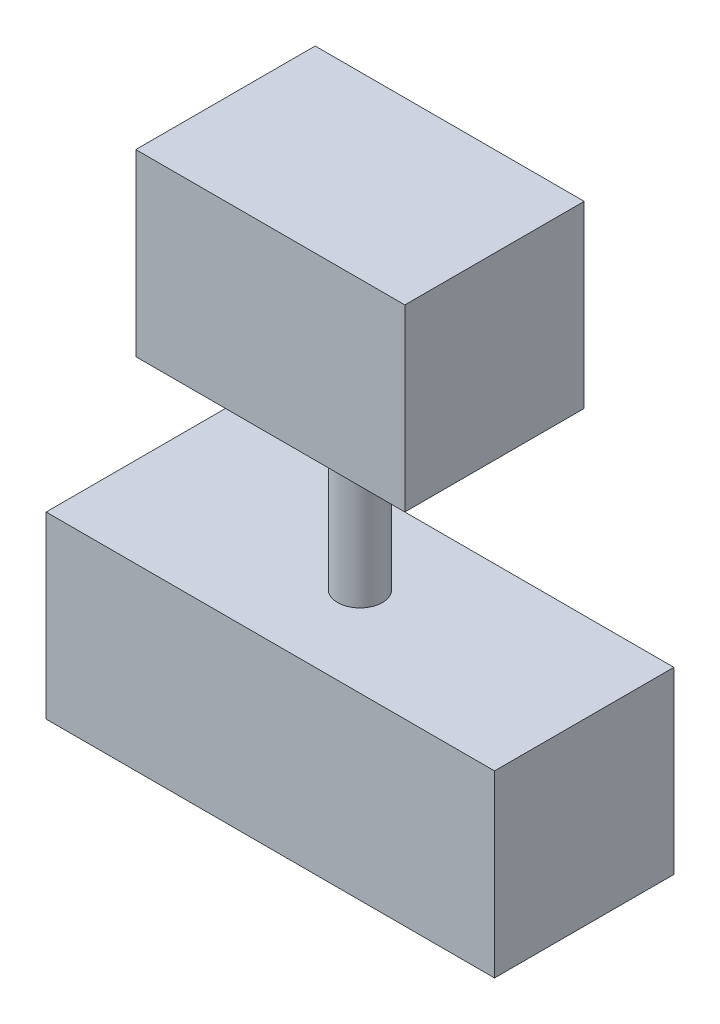
ISO-10303-21;
HEADER;
FILE_DESCRIPTION(('STEP AP214'),'2;1');
FILE_NAME('part.step','',(''),(''),'','','');
FILE_SCHEMA(('AUTOMOTIVE_DESIGN { 1 0 10303 214 1 1 1 1 }'));
ENDSEC;
DATA;
#1=APPLICATION_CONTEXT('core data for automotive mechanical design processes');
#2=APPLICATION_PROTOCOL_DEFINITION('international standard','automotive_design',2000,#1);
#3=PRODUCT_CONTEXT('',#1,'mechanical');
#4=PRODUCT('Part','Part','',(#3));
#5=PRODUCT_RELATED_PRODUCT_CATEGORY('part','',(#4));
#6=PRODUCT_DEFINITION_FORMATION('','',#4);
#7=PRODUCT_DEFINITION_CONTEXT('part definition',#1,'design');
#8=PRODUCT_DEFINITION('design','',#6,#7);
#9=PRODUCT_DEFINITION_SHAPE('','',#8);
#10=(LENGTH_UNIT() NAMED_UNIT(*) SI_UNIT(.MILLI.,.METRE.));
#11=(NAMED_UNIT(*) PLANE_ANGLE_UNIT() SI_UNIT($,.RADIAN.));
#12=(NAMED_UNIT(*) SI_UNIT($,.STERADIAN.) SOLID_ANGLE_UNIT());
#13=UNCERTAINTY_MEASURE_WITH_UNIT(LENGTH_MEASURE(1.E-05),#10,'distance_accuracy_value','');
#14=(GEOMETRIC_REPRESENTATION_CONTEXT(3) GLOBAL_UNCERTAINTY_ASSIGNED_CONTEXT((#13)) GLOBAL_UNIT_ASSIGNED_CONTEXT((#10,
#11,#12)) REPRESENTATION_CONTEXT('',''));
#15=CARTESIAN_POINT('',(0.,0.,0.));
#16=DIRECTION('',(0.,0.,1.));
#17=DIRECTION('',(1.,0.,0.));
#18=AXIS2_PLACEMENT_3D('',#15,#16,#17);
#19=CARTESIAN_POINT('',(15.,50.,20.));
#20=DIRECTION('',(-1.,0.,0.));
#21=DIRECTION('',(0.,-1.,0.));
#22=AXIS2_PLACEMENT_3D('',#19,#20,#21);
#23=PLANE('',#22);
#24=DIRECTION('',(0.,1.,0.));
#25=VECTOR('',#24,1.);
#26=CARTESIAN_POINT('',(15.,50.,0.));
#27=LINE('',#26,#25);
#28=CARTESIAN_POINT('',(15.,30.,0.));
#29=VERTEX_POINT('',#28);
#30=CARTESIAN_POINT('',(15.,50.,0.));
#31=VERTEX_POINT('',#30);
#32=EDGE_CURVE('E111',#29,#31,#27,.T.);
#33=ORIENTED_EDGE('',*,*,#32,.T.);
#34=DIRECTION('',(0.,0.,-1.));
#35=VECTOR('',#34,1.);
#36=CARTESIAN_POINT('',(15.,50.,20.));
#37=LINE('',#36,#35);
#38=CARTESIAN_POINT('',(15.,50.,20.));
#39=VERTEX_POINT('',#38);
#40=EDGE_CURVE('E12',#39,#31,#37,.T.);
#41=ORIENTED_EDGE('',*,*,#40,.F.);
#42=DIRECTION('',(0.,1.,0.));
#43=VECTOR('',#42,1.);
#44=CARTESIAN_POINT('',(15.,50.,20.));
#45=LINE('',#44,#43);
#46=CARTESIAN_POINT('',(15.,30.,20.));
#47=VERTEX_POINT('',#46);
#48=EDGE_CURVE('E99',#47,#39,#45,.T.);
#49=ORIENTED_EDGE('',*,*,#48,.F.);
#50=DIRECTION('',(0.,0.,-1.));
#51=VECTOR('',#50,1.);
#52=CARTESIAN_POINT('',(15.,30.,20.));
#53=LINE('',#52,#51);
#54=EDGE_CURVE('E107',#47,#29,#53,.T.);
#55=ORIENTED_EDGE('',*,*,#54,.T.);
#56=EDGE_LOOP('',(#33,#41,#49,#55));
#57=FACE_BOUND('',#56,.T.);
#58=ADVANCED_FACE('F48',(#57),#23,.F.);
#59=CARTESIAN_POINT('',(15.,50.,20.));
#60=DIRECTION('',(0.,-1.,0.));
#61=DIRECTION('',(0.,0.,-1.));
#62=AXIS2_PLACEMENT_3D('',#59,#60,#61);
#63=PLANE('',#62);
#64=DIRECTION('',(-1.,0.,0.));
#65=VECTOR('',#64,1.);
#66=CARTESIAN_POINT('',(15.,50.,0.));
#67=LINE('',#66,#65);
#68=CARTESIAN_POINT('',(-15.,50.,0.));
#69=VERTEX_POINT('',#68);
#70=EDGE_CURVE('E103',#31,#69,#67,.T.);
#71=ORIENTED_EDGE('',*,*,#70,.T.);
#72=DIRECTION('',(0.,0.,-1.));
#73=VECTOR('',#72,1.);
#74=CARTESIAN_POINT('',(-15.,50.,20.));
#75=LINE('',#74,#73);
#76=CARTESIAN_POINT('',(-15.,50.,20.));
#77=VERTEX_POINT('',#76);
#78=EDGE_CURVE('E56',#77,#69,#75,.T.);
#79=ORIENTED_EDGE('',*,*,#78,.F.);
#80=DIRECTION('',(-1.,0.,0.));
#81=VECTOR('',#80,1.);
#82=CARTESIAN_POINT('',(15.,50.,20.));
#83=LINE('',#82,#81);
#84=EDGE_CURVE('E94',#39,#77,#83,.T.);
#85=ORIENTED_EDGE('',*,*,#84,.F.);
#86=ORIENTED_EDGE('',*,*,#40,.T.);
#87=EDGE_LOOP('',(#71,#79,#85,#86));
#88=FACE_BOUND('',#87,.T.);
#89=ADVANCED_FACE('F102',(#88),#63,.F.);
#90=CARTESIAN_POINT('',(-15.,50.,20.));
#91=DIRECTION('',(1.,0.,0.));
#92=DIRECTION('',(0.,1.,0.));
#93=AXIS2_PLACEMENT_3D('',#90,#91,#92);
#94=PLANE('',#93);
#95=DIRECTION('',(0.,-1.,0.));
#96=VECTOR('',#95,1.);
#97=CARTESIAN_POINT('',(-15.,50.,0.));
#98=LINE('',#97,#96);
#99=CARTESIAN_POINT('',(-15.,30.,0.));
#100=VERTEX_POINT('',#99);
#101=EDGE_CURVE('E81',#69,#100,#98,.T.);
#102=ORIENTED_EDGE('',*,*,#101,.T.);
#103=DIRECTION('',(0.,0.,-1.));
#104=VECTOR('',#103,1.);
#105=CARTESIAN_POINT('',(-15.,30.,20.));
#106=LINE('',#105,#104);
#107=CARTESIAN_POINT('',(-15.,30.,20.));
#108=VERTEX_POINT('',#107);
#109=EDGE_CURVE('E104',#108,#100,#106,.T.);
#110=ORIENTED_EDGE('',*,*,#109,.F.);
#111=DIRECTION('',(0.,-1.,0.));
#112=VECTOR('',#111,1.);
#113=CARTESIAN_POINT('',(-15.,50.,20.));
#114=LINE('',#113,#112);
#115=EDGE_CURVE('E97',#77,#108,#114,.T.);
#116=ORIENTED_EDGE('',*,*,#115,.F.);
#117=ORIENTED_EDGE('',*,*,#78,.T.);
#118=EDGE_LOOP('',(#102,#110,#116,#117));
#119=FACE_BOUND('',#118,.T.);
#120=ADVANCED_FACE('F105',(#119),#94,.F.);
#121=CARTESIAN_POINT('',(15.,30.,20.));
#122=DIRECTION('',(0.,1.,0.));
#123=DIRECTION('',(0.,0.,1.));
#124=AXIS2_PLACEMENT_3D('',#121,#122,#123);
#125=PLANE('',#124);
#126=DIRECTION('',(1.,0.,0.));
#127=VECTOR('',#126,1.);
#128=CARTESIAN_POINT('',(15.,30.,0.));
#129=LINE('',#128,#127);
#130=EDGE_CURVE('E87',#100,#29,#129,.T.);
#131=ORIENTED_EDGE('',*,*,#130,.T.);
#132=ORIENTED_EDGE('',*,*,#54,.F.);
#133=DIRECTION('',(1.,0.,0.));
#134=VECTOR('',#133,1.);
#135=CARTESIAN_POINT('',(15.,30.,20.));
#136=LINE('',#135,#134);
#137=EDGE_CURVE('E64',#108,#47,#136,.T.);
#138=ORIENTED_EDGE('',*,*,#137,.F.);
#139=ORIENTED_EDGE('',*,*,#109,.T.);
#140=EDGE_LOOP('',(#131,#132,#138,#139));
#141=FACE_BOUND('',#140,.T.);
#142=ADVANCED_FACE('F118',(#141),#125,.F.);
#143=CARTESIAN_POINT('',(0.,0.,20.));
#144=DIRECTION('',(0.,0.,-1.));
#145=DIRECTION('',(-1.,0.,0.));
#146=AXIS2_PLACEMENT_3D('',#143,#144,#145);
#147=PLANE('',#146);
#148=ORIENTED_EDGE('',*,*,#48,.T.);
#149=ORIENTED_EDGE('',*,*,#84,.T.);
#150=ORIENTED_EDGE('',*,*,#115,.T.);
#151=ORIENTED_EDGE('',*,*,#137,.T.);
#152=EDGE_LOOP('',(#148,#149,#150,#151));
#153=FACE_BOUND('',#152,.T.);
#154=ADVANCED_FACE('F95',(#153),#147,.F.);
#155=CARTESIAN_POINT('',(0.,0.,0.));
#156=DIRECTION('',(0.,0.,-1.));
#157=DIRECTION('',(-1.,0.,0.));
#158=AXIS2_PLACEMENT_3D('',#155,#156,#157);
#159=PLANE('',#158);
#160=ORIENTED_EDGE('',*,*,#32,.F.);
#161=ORIENTED_EDGE('',*,*,#130,.F.);
#162=ORIENTED_EDGE('',*,*,#101,.F.);
#163=ORIENTED_EDGE('',*,*,#70,.F.);
#164=EDGE_LOOP('',(#160,#161,#162,#163));
#165=FACE_BOUND('',#164,.T.);
#166=ADVANCED_FACE('F121',(#165),#159,.T.);
#167=CLOSED_SHELL('',(#58,#89,#120,#142,#154,#166));
#168=MANIFOLD_SOLID_BREP('B2',#167);
#169=CARTESIAN_POINT('',(0.,30.,10.));
#170=DIRECTION('',(0.,-1.,0.));
#171=DIRECTION('',(0.,0.,-1.));
#172=AXIS2_PLACEMENT_3D('',#169,#170,#171);
#173=CYLINDRICAL_SURFACE('',#172,2.5);
#174=CARTESIAN_POINT('',(0.,30.,10.));
#175=DIRECTION('',(0.,1.,0.));
#176=DIRECTION('',(0.,0.,1.));
#177=AXIS2_PLACEMENT_3D('',#174,#175,#176);
#178=CIRCLE('',#177,2.5);
#179=CARTESIAN_POINT('',(0.,30.,12.5));
#180=VERTEX_POINT('',#179);
#181=EDGE_CURVE('E47',#180,#180,#178,.T.);
#182=ORIENTED_EDGE('',*,*,#181,.F.);
#183=EDGE_LOOP('',(#182));
#184=FACE_BOUND('',#183,.T.);
#185=CARTESIAN_POINT('',(0.,10.,10.));
#186=DIRECTION('',(0.,1.,0.));
#187=DIRECTION('',(0.,0.,1.));
#188=AXIS2_PLACEMENT_3D('',#185,#186,#187);
#189=CIRCLE('',#188,2.5);
#190=CARTESIAN_POINT('',(0.,10.,12.5));
#191=VERTEX_POINT('',#190);
#192=EDGE_CURVE('E196',#191,#191,#189,.T.);
#193=ORIENTED_EDGE('',*,*,#192,.T.);
#194=EDGE_LOOP('',(#193));
#195=FACE_BOUND('',#194,.T.);
#196=ADVANCED_FACE('F193',(#184,#195),#173,.T.);
#197=CARTESIAN_POINT('',(0.,30.,10.));
#198=DIRECTION('',(0.,1.,0.));
#199=DIRECTION('',(0.,0.,1.));
#200=AXIS2_PLACEMENT_3D('',#197,#198,#199);
#201=PLANE('',#200);
#202=ORIENTED_EDGE('',*,*,#181,.T.);
#203=EDGE_LOOP('',(#202));
#204=FACE_BOUND('',#203,.T.);
#205=ADVANCED_FACE('F208',(#204),#201,.T.);
#206=CARTESIAN_POINT('',(0.,10.,10.));
#207=DIRECTION('',(0.,1.,0.));
#208=DIRECTION('',(0.,0.,1.));
#209=AXIS2_PLACEMENT_3D('',#206,#207,#208);
#210=PLANE('',#209);
#211=ORIENTED_EDGE('',*,*,#192,.F.);
#212=EDGE_LOOP('',(#211));
#213=FACE_BOUND('',#212,.T.);
#214=ADVANCED_FACE('F206',(#213),#210,.F.);
#215=CLOSED_SHELL('',(#196,#205,#214));
#216=MANIFOLD_SOLID_BREP('B6',#215);
#217=CARTESIAN_POINT('',(25.,-10.,20.));
#218=DIRECTION('',(-1.,0.,0.));
#219=DIRECTION('',(0.,0.,1.));
#220=AXIS2_PLACEMENT_3D('',#217,#218,#219);
#221=PLANE('',#220);
#222=DIRECTION('',(0.,1.,0.));
#223=VECTOR('',#222,1.);
#224=CARTESIAN_POINT('',(25.,-10.,0.));
#225=LINE('',#224,#223);
#226=CARTESIAN_POINT('',(25.,-10.,0.));
#227=VERTEX_POINT('',#226);
#228=CARTESIAN_POINT('',(25.,10.,0.));
#229=VERTEX_POINT('',#228);
#230=EDGE_CURVE('E303',#227,#229,#225,.T.);
#231=ORIENTED_EDGE('',*,*,#230,.T.);
#232=DIRECTION('',(0.,0.,-1.));
#233=VECTOR('',#232,1.);
#234=CARTESIAN_POINT('',(25.,10.,20.));
#235=LINE('',#234,#233);
#236=CARTESIAN_POINT('',(25.,10.,20.));
#237=VERTEX_POINT('',#236);
#238=EDGE_CURVE('E191',#237,#229,#235,.T.);
#239=ORIENTED_EDGE('',*,*,#238,.F.);
#240=DIRECTION('',(0.,1.,0.));
#241=VECTOR('',#240,1.);
#242=CARTESIAN_POINT('',(25.,-10.,20.));
#243=LINE('',#242,#241);
#244=CARTESIAN_POINT('',(25.,-10.,20.));
#245=VERTEX_POINT('',#244);
#246=EDGE_CURVE('E291',#245,#237,#243,.T.);
#247=ORIENTED_EDGE('',*,*,#246,.F.);
#248=DIRECTION('',(0.,0.,-1.));
#249=VECTOR('',#248,1.);
#250=CARTESIAN_POINT('',(25.,-10.,20.));
#251=LINE('',#250,#249);
#252=EDGE_CURVE('E299',#245,#227,#251,.T.);
#253=ORIENTED_EDGE('',*,*,#252,.T.);
#254=EDGE_LOOP('',(#231,#239,#247,#253));
#255=FACE_BOUND('',#254,.T.);
#256=ADVANCED_FACE('F240',(#255),#221,.F.);
#257=CARTESIAN_POINT('',(-25.,10.,20.));
#258=DIRECTION('',(0.,-1.,0.));
#259=DIRECTION('',(0.,0.,-1.));
#260=AXIS2_PLACEMENT_3D('',#257,#258,#259);
#261=PLANE('',#260);
#262=DIRECTION('',(-1.,0.,0.));
#263=VECTOR('',#262,1.);
#264=CARTESIAN_POINT('',(-25.,10.,0.));
#265=LINE('',#264,#263);
#266=CARTESIAN_POINT('',(-25.,10.,0.));
#267=VERTEX_POINT('',#266);
#268=EDGE_CURVE('E295',#229,#267,#265,.T.);
#269=ORIENTED_EDGE('',*,*,#268,.T.);
#270=DIRECTION('',(0.,0.,-1.));
#271=VECTOR('',#270,1.);
#272=CARTESIAN_POINT('',(-25.,10.,20.));
#273=LINE('',#272,#271);
#274=CARTESIAN_POINT('',(-25.,10.,20.));
#275=VERTEX_POINT('',#274);
#276=EDGE_CURVE('E248',#275,#267,#273,.T.);
#277=ORIENTED_EDGE('',*,*,#276,.F.);
#278=DIRECTION('',(-1.,0.,0.));
#279=VECTOR('',#278,1.);
#280=CARTESIAN_POINT('',(-25.,10.,20.));
#281=LINE('',#280,#279);
#282=EDGE_CURVE('E286',#237,#275,#281,.T.);
#283=ORIENTED_EDGE('',*,*,#282,.F.);
#284=ORIENTED_EDGE('',*,*,#238,.T.);
#285=EDGE_LOOP('',(#269,#277,#283,#284));
#286=FACE_BOUND('',#285,.T.);
#287=ADVANCED_FACE('F294',(#286),#261,.F.);
#288=CARTESIAN_POINT('',(-25.,-10.,20.));
#289=DIRECTION('',(1.,0.,0.));
#290=DIRECTION('',(0.,0.,-1.));
#291=AXIS2_PLACEMENT_3D('',#288,#289,#290);
#292=PLANE('',#291);
#293=DIRECTION('',(0.,-1.,0.));
#294=VECTOR('',#293,1.);
#295=CARTESIAN_POINT('',(-25.,-10.,0.));
#296=LINE('',#295,#294);
#297=CARTESIAN_POINT('',(-25.,-10.,0.));
#298=VERTEX_POINT('',#297);
#299=EDGE_CURVE('E273',#267,#298,#296,.T.);
#300=ORIENTED_EDGE('',*,*,#299,.T.);
#301=DIRECTION('',(0.,0.,-1.));
#302=VECTOR('',#301,1.);
#303=CARTESIAN_POINT('',(-25.,-10.,20.));
#304=LINE('',#303,#302);
#305=CARTESIAN_POINT('',(-25.,-10.,20.));
#306=VERTEX_POINT('',#305);
#307=EDGE_CURVE('E296',#306,#298,#304,.T.);
#308=ORIENTED_EDGE('',*,*,#307,.F.);
#309=DIRECTION('',(0.,-1.,0.));
#310=VECTOR('',#309,1.);
#311=CARTESIAN_POINT('',(-25.,-10.,20.));
#312=LINE('',#311,#310);
#313=EDGE_CURVE('E289',#275,#306,#312,.T.);
#314=ORIENTED_EDGE('',*,*,#313,.F.);
#315=ORIENTED_EDGE('',*,*,#276,.T.);
#316=EDGE_LOOP('',(#300,#308,#314,#315));
#317=FACE_BOUND('',#316,.T.);
#318=ADVANCED_FACE('F297',(#317),#292,.F.);
#319=CARTESIAN_POINT('',(-25.,-10.,20.));
#320=DIRECTION('',(0.,1.,0.));
#321=DIRECTION('',(0.,0.,1.));
#322=AXIS2_PLACEMENT_3D('',#319,#320,#321);
#323=PLANE('',#322);
#324=DIRECTION('',(1.,0.,0.));
#325=VECTOR('',#324,1.);
#326=CARTESIAN_POINT('',(-25.,-10.,0.));
#327=LINE('',#326,#325);
#328=EDGE_CURVE('E279',#298,#227,#327,.T.);
#329=ORIENTED_EDGE('',*,*,#328,.T.);
#330=ORIENTED_EDGE('',*,*,#252,.F.);
#331=DIRECTION('',(1.,0.,0.));
#332=VECTOR('',#331,1.);
#333=CARTESIAN_POINT('',(-25.,-10.,20.));
#334=LINE('',#333,#332);
#335=EDGE_CURVE('E256',#306,#245,#334,.T.);
#336=ORIENTED_EDGE('',*,*,#335,.F.);
#337=ORIENTED_EDGE('',*,*,#307,.T.);
#338=EDGE_LOOP('',(#329,#330,#336,#337));
#339=FACE_BOUND('',#338,.T.);
#340=ADVANCED_FACE('F310',(#339),#323,.F.);
#341=CARTESIAN_POINT('',(0.,0.,20.));
#342=DIRECTION('',(0.,0.,-1.));
#343=DIRECTION('',(-1.,0.,0.));
#344=AXIS2_PLACEMENT_3D('',#341,#342,#343);
#345=PLANE('',#344);
#346=ORIENTED_EDGE('',*,*,#246,.T.);
#347=ORIENTED_EDGE('',*,*,#282,.T.);
#348=ORIENTED_EDGE('',*,*,#313,.T.);
#349=ORIENTED_EDGE('',*,*,#335,.T.);
#350=EDGE_LOOP('',(#346,#347,#348,#349));
#351=FACE_BOUND('',#350,.T.);
#352=ADVANCED_FACE('F287',(#351),#345,.F.);
#353=CARTESIAN_POINT('',(0.,0.,0.));
#354=DIRECTION('',(0.,0.,-1.));
#355=DIRECTION('',(-1.,0.,0.));
#356=AXIS2_PLACEMENT_3D('',#353,#354,#355);
#357=PLANE('',#356);
#358=ORIENTED_EDGE('',*,*,#230,.F.);
#359=ORIENTED_EDGE('',*,*,#328,.F.);
#360=ORIENTED_EDGE('',*,*,#299,.F.);
#361=ORIENTED_EDGE('',*,*,#268,.F.);
#362=EDGE_LOOP('',(#358,#359,#360,#361));
#363=FACE_BOUND('',#362,.T.);
#364=ADVANCED_FACE('F313',(#363),#357,.T.);
#365=CLOSED_SHELL('',(#256,#287,#318,#340,#352,#364));
#366=MANIFOLD_SOLID_BREP('B42',#365);
#367=ADVANCED_BREP_SHAPE_REPRESENTATION('',(#18,#168,#216,#366),#14);
#368=SHAPE_DEFINITION_REPRESENTATION(#9,#367);
ENDSEC;
END-ISO-10303-21;
